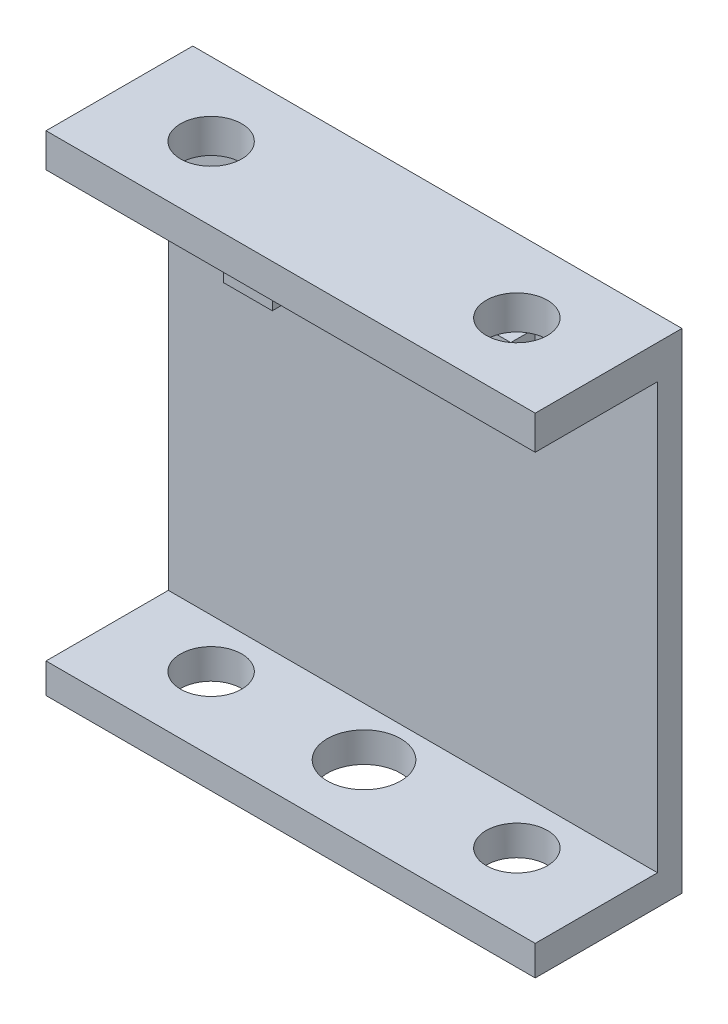
ISO-10303-21;
HEADER;
FILE_DESCRIPTION(('STEP AP214'),'2;1');
FILE_NAME('part.step','',(''),(''),'','','');
FILE_SCHEMA(('AUTOMOTIVE_DESIGN { 1 0 10303 214 1 1 1 1 }'));
ENDSEC;
DATA;
#1=APPLICATION_CONTEXT('core data for automotive mechanical design processes');
#2=APPLICATION_PROTOCOL_DEFINITION('international standard','automotive_design',2000,#1);
#3=PRODUCT_CONTEXT('',#1,'mechanical');
#4=PRODUCT('Part','Part','',(#3));
#5=PRODUCT_RELATED_PRODUCT_CATEGORY('part','',(#4));
#6=PRODUCT_DEFINITION_FORMATION('','',#4);
#7=PRODUCT_DEFINITION_CONTEXT('part definition',#1,'design');
#8=PRODUCT_DEFINITION('design','',#6,#7);
#9=PRODUCT_DEFINITION_SHAPE('','',#8);
#10=(LENGTH_UNIT() NAMED_UNIT(*) SI_UNIT(.MILLI.,.METRE.));
#11=(NAMED_UNIT(*) PLANE_ANGLE_UNIT() SI_UNIT($,.RADIAN.));
#12=(NAMED_UNIT(*) SI_UNIT($,.STERADIAN.) SOLID_ANGLE_UNIT());
#13=UNCERTAINTY_MEASURE_WITH_UNIT(LENGTH_MEASURE(1.E-05),#10,'distance_accuracy_value','');
#14=(GEOMETRIC_REPRESENTATION_CONTEXT(3) GLOBAL_UNCERTAINTY_ASSIGNED_CONTEXT((#13)) GLOBAL_UNIT_ASSIGNED_CONTEXT((#10,
#11,#12)) REPRESENTATION_CONTEXT('',''));
#15=CARTESIAN_POINT('',(0.,0.,0.));
#16=DIRECTION('',(0.,0.,1.));
#17=DIRECTION('',(1.,0.,0.));
#18=AXIS2_PLACEMENT_3D('',#15,#16,#17);
#19=CARTESIAN_POINT('',(0.,0.,2.));
#20=DIRECTION('',(0.,0.,1.));
#21=DIRECTION('',(1.,0.,0.));
#22=AXIS2_PLACEMENT_3D('',#19,#20,#21);
#23=PLANE('',#22);
#24=DIRECTION('',(0.,-1.,0.));
#25=VECTOR('',#24,1.);
#26=CARTESIAN_POINT('',(0.,-2.77187355296293,2.));
#27=LINE('',#26,#25);
#28=CARTESIAN_POINT('',(0.,-2.77187355296293,2.));
#29=VERTEX_POINT('',#28);
#30=CARTESIAN_POINT('',(0.,-37.5471930148189,2.));
#31=VERTEX_POINT('',#30);
#32=EDGE_CURVE('E239',#29,#31,#27,.T.);
#33=ORIENTED_EDGE('',*,*,#32,.T.);
#34=DIRECTION('',(1.,0.,0.));
#35=VECTOR('',#34,1.);
#36=CARTESIAN_POINT('',(0.,-37.5471930148189,2.));
#37=LINE('',#36,#35);
#38=CARTESIAN_POINT('',(40.,-37.5471930148189,2.));
#39=VERTEX_POINT('',#38);
#40=EDGE_CURVE('E243',#31,#39,#37,.T.);
#41=ORIENTED_EDGE('',*,*,#40,.T.);
#42=DIRECTION('',(0.,1.,0.));
#43=VECTOR('',#42,1.);
#44=CARTESIAN_POINT('',(40.,-2.77187355296293,2.));
#45=LINE('',#44,#43);
#46=CARTESIAN_POINT('',(40.,-2.77187355296293,2.));
#47=VERTEX_POINT('',#46);
#48=EDGE_CURVE('E248',#39,#47,#45,.T.);
#49=ORIENTED_EDGE('',*,*,#48,.T.);
#50=DIRECTION('',(-1.,0.,0.));
#51=VECTOR('',#50,1.);
#52=CARTESIAN_POINT('',(0.,-2.77187355296293,2.));
#53=LINE('',#52,#51);
#54=EDGE_CURVE('E251',#47,#29,#53,.T.);
#55=ORIENTED_EDGE('',*,*,#54,.T.);
#56=EDGE_LOOP('',(#33,#41,#49,#55));
#57=FACE_BOUND('',#56,.T.);
#58=DIRECTION('',(0.,-1.,0.));
#59=VECTOR('',#58,1.);
#60=CARTESIAN_POINT('',(26.,0.,2.));
#61=LINE('',#60,#59);
#62=CARTESIAN_POINT('',(26.,-4.,2.));
#63=VERTEX_POINT('',#62);
#64=CARTESIAN_POINT('',(26.,-8.,2.));
#65=VERTEX_POINT('',#64);
#66=EDGE_CURVE('E189',#63,#65,#61,.T.);
#67=ORIENTED_EDGE('',*,*,#66,.F.);
#68=DIRECTION('',(-1.,0.,0.));
#69=VECTOR('',#68,1.);
#70=CARTESIAN_POINT('',(0.,-4.,2.));
#71=LINE('',#70,#69);
#72=CARTESIAN_POINT('',(30.,-4.,2.));
#73=VERTEX_POINT('',#72);
#74=EDGE_CURVE('E184',#73,#63,#71,.T.);
#75=ORIENTED_EDGE('',*,*,#74,.F.);
#76=DIRECTION('',(0.,-1.,0.));
#77=VECTOR('',#76,1.);
#78=CARTESIAN_POINT('',(30.,0.,2.));
#79=LINE('',#78,#77);
#80=CARTESIAN_POINT('',(30.,-8.,2.));
#81=VERTEX_POINT('',#80);
#82=EDGE_CURVE('E200',#73,#81,#79,.T.);
#83=ORIENTED_EDGE('',*,*,#82,.T.);
#84=DIRECTION('',(-1.,0.,0.));
#85=VECTOR('',#84,1.);
#86=CARTESIAN_POINT('',(0.,-8.,2.));
#87=LINE('',#86,#85);
#88=EDGE_CURVE('E215',#81,#65,#87,.T.);
#89=ORIENTED_EDGE('',*,*,#88,.T.);
#90=EDGE_LOOP('',(#67,#75,#83,#89));
#91=FACE_BOUND('',#90,.T.);
#92=DIRECTION('',(0.,-1.,0.));
#93=VECTOR('',#92,1.);
#94=CARTESIAN_POINT('',(9.99999999999999,0.,2.));
#95=LINE('',#94,#93);
#96=CARTESIAN_POINT('',(9.99999999999999,-4.,2.));
#97=VERTEX_POINT('',#96);
#98=CARTESIAN_POINT('',(9.99999999999999,-8.,2.));
#99=VERTEX_POINT('',#98);
#100=EDGE_CURVE('E61',#97,#99,#95,.T.);
#101=ORIENTED_EDGE('',*,*,#100,.F.);
#102=DIRECTION('',(-1.,0.,0.));
#103=VECTOR('',#102,1.);
#104=CARTESIAN_POINT('',(0.,-4.,2.));
#105=LINE('',#104,#103);
#106=CARTESIAN_POINT('',(14.,-4.,2.));
#107=VERTEX_POINT('',#106);
#108=EDGE_CURVE('E182',#107,#97,#105,.T.);
#109=ORIENTED_EDGE('',*,*,#108,.F.);
#110=DIRECTION('',(0.,-1.,0.));
#111=VECTOR('',#110,1.);
#112=CARTESIAN_POINT('',(14.,0.,2.));
#113=LINE('',#112,#111);
#114=CARTESIAN_POINT('',(14.,-8.,2.));
#115=VERTEX_POINT('',#114);
#116=EDGE_CURVE('E179',#107,#115,#113,.T.);
#117=ORIENTED_EDGE('',*,*,#116,.T.);
#118=DIRECTION('',(-1.,0.,0.));
#119=VECTOR('',#118,1.);
#120=CARTESIAN_POINT('',(0.,-8.,2.));
#121=LINE('',#120,#119);
#122=EDGE_CURVE('E66',#115,#99,#121,.T.);
#123=ORIENTED_EDGE('',*,*,#122,.T.);
#124=EDGE_LOOP('',(#101,#109,#117,#123));
#125=FACE_BOUND('',#124,.T.);
#126=ADVANCED_FACE('F43',(#57,#91,#125),#23,.T.);
#127=CARTESIAN_POINT('',(0.,0.,12.));
#128=DIRECTION('',(0.,0.,1.));
#129=DIRECTION('',(1.,0.,0.));
#130=AXIS2_PLACEMENT_3D('',#127,#128,#129);
#131=PLANE('',#130);
#132=DIRECTION('',(-1.,0.,0.));
#133=VECTOR('',#132,1.);
#134=CARTESIAN_POINT('',(0.,-2.77187355296293,12.));
#135=LINE('',#134,#133);
#136=CARTESIAN_POINT('',(40.,-2.77187355296293,12.));
#137=VERTEX_POINT('',#136);
#138=CARTESIAN_POINT('',(0.,-2.77187355296293,12.));
#139=VERTEX_POINT('',#138);
#140=EDGE_CURVE('E244',#137,#139,#135,.T.);
#141=ORIENTED_EDGE('',*,*,#140,.F.);
#142=DIRECTION('',(0.,1.,0.));
#143=VECTOR('',#142,1.);
#144=CARTESIAN_POINT('',(40.,0.,12.));
#145=LINE('',#144,#143);
#146=CARTESIAN_POINT('',(40.,0.,12.));
#147=VERTEX_POINT('',#146);
#148=EDGE_CURVE('E309',#137,#147,#145,.T.);
#149=ORIENTED_EDGE('',*,*,#148,.T.);
#150=DIRECTION('',(-1.,0.,0.));
#151=VECTOR('',#150,1.);
#152=CARTESIAN_POINT('',(0.,0.,12.));
#153=LINE('',#152,#151);
#154=CARTESIAN_POINT('',(0.,0.,12.));
#155=VERTEX_POINT('',#154);
#156=EDGE_CURVE('E314',#147,#155,#153,.T.);
#157=ORIENTED_EDGE('',*,*,#156,.T.);
#158=DIRECTION('',(0.,-1.,0.));
#159=VECTOR('',#158,1.);
#160=CARTESIAN_POINT('',(0.,0.,12.));
#161=LINE('',#160,#159);
#162=EDGE_CURVE('E301',#155,#139,#161,.T.);
#163=ORIENTED_EDGE('',*,*,#162,.T.);
#164=EDGE_LOOP('',(#141,#149,#157,#163));
#165=FACE_BOUND('',#164,.T.);
#166=ADVANCED_FACE('F362',(#165),#131,.T.);
#167=CARTESIAN_POINT('',(32.5,-40.,6.));
#168=DIRECTION('',(0.,1.,0.));
#169=DIRECTION('',(0.,0.,1.));
#170=AXIS2_PLACEMENT_3D('',#167,#168,#169);
#171=CYLINDRICAL_SURFACE('',#170,2.5);
#172=CARTESIAN_POINT('',(32.5,-2.77187355296293,6.));
#173=DIRECTION('',(0.,1.,0.));
#174=DIRECTION('',(0.,0.,1.));
#175=AXIS2_PLACEMENT_3D('',#172,#173,#174);
#176=CIRCLE('',#175,2.5);
#177=CARTESIAN_POINT('',(32.5,-2.77187355296293,8.5));
#178=VERTEX_POINT('',#177);
#179=EDGE_CURVE('E280',#178,#178,#176,.F.);
#180=ORIENTED_EDGE('',*,*,#179,.T.);
#181=EDGE_LOOP('',(#180));
#182=FACE_BOUND('',#181,.T.);
#183=CARTESIAN_POINT('',(32.5,0.,6.));
#184=DIRECTION('',(0.,1.,0.));
#185=DIRECTION('',(0.,0.,1.));
#186=AXIS2_PLACEMENT_3D('',#183,#184,#185);
#187=CIRCLE('',#186,2.5);
#188=CARTESIAN_POINT('',(32.5,0.,8.5));
#189=VERTEX_POINT('',#188);
#190=EDGE_CURVE('E294',#189,#189,#187,.T.);
#191=ORIENTED_EDGE('',*,*,#190,.T.);
#192=EDGE_LOOP('',(#191));
#193=FACE_BOUND('',#192,.T.);
#194=ADVANCED_FACE('F359',(#182,#193),#171,.F.);
#195=CARTESIAN_POINT('',(7.5,-40.,6.));
#196=DIRECTION('',(0.,1.,0.));
#197=DIRECTION('',(0.,0.,1.));
#198=AXIS2_PLACEMENT_3D('',#195,#196,#197);
#199=CYLINDRICAL_SURFACE('',#198,2.5);
#200=CARTESIAN_POINT('',(7.5,-2.77187355296293,6.));
#201=DIRECTION('',(0.,1.,0.));
#202=DIRECTION('',(0.,0.,1.));
#203=AXIS2_PLACEMENT_3D('',#200,#201,#202);
#204=CIRCLE('',#203,2.5);
#205=CARTESIAN_POINT('',(7.5,-2.77187355296293,8.5));
#206=VERTEX_POINT('',#205);
#207=EDGE_CURVE('E279',#206,#206,#204,.F.);
#208=ORIENTED_EDGE('',*,*,#207,.T.);
#209=EDGE_LOOP('',(#208));
#210=FACE_BOUND('',#209,.T.);
#211=CARTESIAN_POINT('',(7.5,0.,6.));
#212=DIRECTION('',(0.,1.,0.));
#213=DIRECTION('',(0.,0.,1.));
#214=AXIS2_PLACEMENT_3D('',#211,#212,#213);
#215=CIRCLE('',#214,2.5);
#216=CARTESIAN_POINT('',(7.5,0.,8.5));
#217=VERTEX_POINT('',#216);
#218=EDGE_CURVE('E290',#217,#217,#215,.T.);
#219=ORIENTED_EDGE('',*,*,#218,.T.);
#220=EDGE_LOOP('',(#219));
#221=FACE_BOUND('',#220,.T.);
#222=ADVANCED_FACE('F346',(#210,#221),#199,.F.);
#223=CARTESIAN_POINT('',(0.,0.,12.));
#224=DIRECTION('',(1.,0.,0.));
#225=DIRECTION('',(0.,0.,-1.));
#226=AXIS2_PLACEMENT_3D('',#223,#224,#225);
#227=PLANE('',#226);
#228=ORIENTED_EDGE('',*,*,#32,.F.);
#229=DIRECTION('',(0.,0.,1.));
#230=VECTOR('',#229,1.);
#231=CARTESIAN_POINT('',(0.,-2.77187355296293,2.));
#232=LINE('',#231,#230);
#233=EDGE_CURVE('E261',#29,#139,#232,.T.);
#234=ORIENTED_EDGE('',*,*,#233,.T.);
#235=ORIENTED_EDGE('',*,*,#162,.F.);
#236=DIRECTION('',(0.,0.,-1.));
#237=VECTOR('',#236,1.);
#238=CARTESIAN_POINT('',(0.,0.,12.));
#239=LINE('',#238,#237);
#240=CARTESIAN_POINT('',(0.,0.,0.));
#241=VERTEX_POINT('',#240);
#242=EDGE_CURVE('E317',#155,#241,#239,.T.);
#243=ORIENTED_EDGE('',*,*,#242,.T.);
#244=DIRECTION('',(0.,-1.,0.));
#245=VECTOR('',#244,1.);
#246=CARTESIAN_POINT('',(0.,0.,0.));
#247=LINE('',#246,#245);
#248=CARTESIAN_POINT('',(0.,-40.,0.));
#249=VERTEX_POINT('',#248);
#250=EDGE_CURVE('E289',#241,#249,#247,.T.);
#251=ORIENTED_EDGE('',*,*,#250,.T.);
#252=DIRECTION('',(0.,0.,-1.));
#253=VECTOR('',#252,1.);
#254=CARTESIAN_POINT('',(0.,-40.,12.));
#255=LINE('',#254,#253);
#256=CARTESIAN_POINT('',(0.,-40.,12.));
#257=VERTEX_POINT('',#256);
#258=EDGE_CURVE('E11',#257,#249,#255,.T.);
#259=ORIENTED_EDGE('',*,*,#258,.F.);
#260=CARTESIAN_POINT('',(0.,-37.5471930148189,12.));
#261=VERTEX_POINT('',#260);
#262=EDGE_CURVE('E306',#261,#257,#161,.T.);
#263=ORIENTED_EDGE('',*,*,#262,.F.);
#264=DIRECTION('',(0.,0.,1.));
#265=VECTOR('',#264,1.);
#266=CARTESIAN_POINT('',(0.,-37.5471930148189,2.));
#267=LINE('',#266,#265);
#268=EDGE_CURVE('E255',#31,#261,#267,.T.);
#269=ORIENTED_EDGE('',*,*,#268,.F.);
#270=EDGE_LOOP('',(#228,#234,#235,#243,#251,#259,#263,#269));
#271=FACE_BOUND('',#270,.T.);
#272=ADVANCED_FACE('F45',(#271),#227,.F.);
#273=CARTESIAN_POINT('',(0.,-40.,12.));
#274=DIRECTION('',(0.,1.,0.));
#275=DIRECTION('',(0.,0.,1.));
#276=AXIS2_PLACEMENT_3D('',#273,#274,#275);
#277=PLANE('',#276);
#278=CARTESIAN_POINT('',(20.,-40.,6.));
#279=DIRECTION('',(0.,-1.,0.));
#280=DIRECTION('',(0.,0.,-1.));
#281=AXIS2_PLACEMENT_3D('',#278,#279,#280);
#282=CIRCLE('',#281,3.);
#283=CARTESIAN_POINT('',(20.,-40.,3.));
#284=VERTEX_POINT('',#283);
#285=EDGE_CURVE('E235',#284,#284,#282,.T.);
#286=ORIENTED_EDGE('',*,*,#285,.F.);
#287=EDGE_LOOP('',(#286));
#288=FACE_BOUND('',#287,.T.);
#289=CARTESIAN_POINT('',(7.5,-40.,6.));
#290=DIRECTION('',(0.,1.,0.));
#291=DIRECTION('',(0.,0.,1.));
#292=AXIS2_PLACEMENT_3D('',#289,#290,#291);
#293=CIRCLE('',#292,2.5);
#294=CARTESIAN_POINT('',(7.5,-40.,8.5));
#295=VERTEX_POINT('',#294);
#296=EDGE_CURVE('E285',#295,#295,#293,.T.);
#297=ORIENTED_EDGE('',*,*,#296,.T.);
#298=EDGE_LOOP('',(#297));
#299=FACE_BOUND('',#298,.T.);
#300=CARTESIAN_POINT('',(32.5,-40.,6.));
#301=DIRECTION('',(0.,1.,0.));
#302=DIRECTION('',(0.,0.,1.));
#303=AXIS2_PLACEMENT_3D('',#300,#301,#302);
#304=CIRCLE('',#303,2.5);
#305=CARTESIAN_POINT('',(32.5,-40.,8.5));
#306=VERTEX_POINT('',#305);
#307=EDGE_CURVE('E284',#306,#306,#304,.T.);
#308=ORIENTED_EDGE('',*,*,#307,.T.);
#309=EDGE_LOOP('',(#308));
#310=FACE_BOUND('',#309,.T.);
#311=DIRECTION('',(1.,0.,0.));
#312=VECTOR('',#311,1.);
#313=CARTESIAN_POINT('',(0.,-40.,0.));
#314=LINE('',#313,#312);
#315=CARTESIAN_POINT('',(40.,-40.,0.));
#316=VERTEX_POINT('',#315);
#317=EDGE_CURVE('E321',#249,#316,#314,.T.);
#318=ORIENTED_EDGE('',*,*,#317,.T.);
#319=DIRECTION('',(0.,0.,-1.));
#320=VECTOR('',#319,1.);
#321=CARTESIAN_POINT('',(40.,-40.,12.));
#322=LINE('',#321,#320);
#323=CARTESIAN_POINT('',(40.,-40.,12.));
#324=VERTEX_POINT('',#323);
#325=EDGE_CURVE('E53',#324,#316,#322,.T.);
#326=ORIENTED_EDGE('',*,*,#325,.F.);
#327=DIRECTION('',(1.,0.,0.));
#328=VECTOR('',#327,1.);
#329=CARTESIAN_POINT('',(0.,-40.,12.));
#330=LINE('',#329,#328);
#331=EDGE_CURVE('E305',#257,#324,#330,.T.);
#332=ORIENTED_EDGE('',*,*,#331,.F.);
#333=ORIENTED_EDGE('',*,*,#258,.T.);
#334=EDGE_LOOP('',(#318,#326,#332,#333));
#335=FACE_BOUND('',#334,.T.);
#336=ADVANCED_FACE('F389',(#288,#299,#310,#335),#277,.F.);
#337=CARTESIAN_POINT('',(40.,0.,12.));
#338=DIRECTION('',(-1.,0.,0.));
#339=DIRECTION('',(0.,0.,1.));
#340=AXIS2_PLACEMENT_3D('',#337,#338,#339);
#341=PLANE('',#340);
#342=ORIENTED_EDGE('',*,*,#148,.F.);
#343=DIRECTION('',(0.,0.,1.));
#344=VECTOR('',#343,1.);
#345=CARTESIAN_POINT('',(40.,-2.77187355296293,2.));
#346=LINE('',#345,#344);
#347=EDGE_CURVE('E266',#47,#137,#346,.T.);
#348=ORIENTED_EDGE('',*,*,#347,.F.);
#349=ORIENTED_EDGE('',*,*,#48,.F.);
#350=DIRECTION('',(0.,0.,1.));
#351=VECTOR('',#350,1.);
#352=CARTESIAN_POINT('',(40.,-37.5471930148189,2.));
#353=LINE('',#352,#351);
#354=CARTESIAN_POINT('',(40.,-37.5471930148189,12.));
#355=VERTEX_POINT('',#354);
#356=EDGE_CURVE('E269',#39,#355,#353,.T.);
#357=ORIENTED_EDGE('',*,*,#356,.T.);
#358=EDGE_CURVE('E310',#324,#355,#145,.T.);
#359=ORIENTED_EDGE('',*,*,#358,.F.);
#360=ORIENTED_EDGE('',*,*,#325,.T.);
#361=DIRECTION('',(0.,1.,0.));
#362=VECTOR('',#361,1.);
#363=CARTESIAN_POINT('',(40.,0.,0.));
#364=LINE('',#363,#362);
#365=CARTESIAN_POINT('',(40.,0.,0.));
#366=VERTEX_POINT('',#365);
#367=EDGE_CURVE('E324',#316,#366,#364,.T.);
#368=ORIENTED_EDGE('',*,*,#367,.T.);
#369=DIRECTION('',(0.,0.,-1.));
#370=VECTOR('',#369,1.);
#371=CARTESIAN_POINT('',(40.,0.,12.));
#372=LINE('',#371,#370);
#373=EDGE_CURVE('E333',#147,#366,#372,.T.);
#374=ORIENTED_EDGE('',*,*,#373,.F.);
#375=EDGE_LOOP('',(#342,#348,#349,#357,#359,#360,#368,#374));
#376=FACE_BOUND('',#375,.T.);
#377=ADVANCED_FACE('F371',(#376),#341,.F.);
#378=CARTESIAN_POINT('',(0.,0.,12.));
#379=DIRECTION('',(0.,-1.,0.));
#380=DIRECTION('',(0.,0.,-1.));
#381=AXIS2_PLACEMENT_3D('',#378,#379,#380);
#382=PLANE('',#381);
#383=ORIENTED_EDGE('',*,*,#218,.F.);
#384=EDGE_LOOP('',(#383));
#385=FACE_BOUND('',#384,.T.);
#386=ORIENTED_EDGE('',*,*,#190,.F.);
#387=EDGE_LOOP('',(#386));
#388=FACE_BOUND('',#387,.T.);
#389=DIRECTION('',(-1.,0.,0.));
#390=VECTOR('',#389,1.);
#391=CARTESIAN_POINT('',(0.,0.,0.));
#392=LINE('',#391,#390);
#393=EDGE_CURVE('E327',#366,#241,#392,.T.);
#394=ORIENTED_EDGE('',*,*,#393,.T.);
#395=ORIENTED_EDGE('',*,*,#242,.F.);
#396=ORIENTED_EDGE('',*,*,#156,.F.);
#397=ORIENTED_EDGE('',*,*,#373,.T.);
#398=EDGE_LOOP('',(#394,#395,#396,#397));
#399=FACE_BOUND('',#398,.T.);
#400=ADVANCED_FACE('F367',(#385,#388,#399),#382,.F.);
#401=DIRECTION('',(1.,0.,0.));
#402=VECTOR('',#401,1.);
#403=CARTESIAN_POINT('',(0.,-37.5471930148189,12.));
#404=LINE('',#403,#402);
#405=EDGE_CURVE('E256',#261,#355,#404,.T.);
#406=ORIENTED_EDGE('',*,*,#405,.F.);
#407=ORIENTED_EDGE('',*,*,#262,.T.);
#408=ORIENTED_EDGE('',*,*,#331,.T.);
#409=ORIENTED_EDGE('',*,*,#358,.T.);
#410=EDGE_LOOP('',(#406,#407,#408,#409));
#411=FACE_BOUND('',#410,.T.);
#412=ADVANCED_FACE('F370',(#411),#131,.T.);
#413=CARTESIAN_POINT('',(0.,0.,0.));
#414=DIRECTION('',(0.,0.,1.));
#415=DIRECTION('',(1.,0.,0.));
#416=AXIS2_PLACEMENT_3D('',#413,#414,#415);
#417=PLANE('',#416);
#418=ORIENTED_EDGE('',*,*,#250,.F.);
#419=ORIENTED_EDGE('',*,*,#393,.F.);
#420=ORIENTED_EDGE('',*,*,#367,.F.);
#421=ORIENTED_EDGE('',*,*,#317,.F.);
#422=EDGE_LOOP('',(#418,#419,#420,#421));
#423=FACE_BOUND('',#422,.T.);
#424=ADVANCED_FACE('F385',(#423),#417,.F.);
#425=CARTESIAN_POINT('',(32.5,-37.5471930148189,6.));
#426=DIRECTION('',(0.,-1.,0.));
#427=DIRECTION('',(0.,0.,-1.));
#428=AXIS2_PLACEMENT_3D('',#425,#426,#427);
#429=CIRCLE('',#428,2.5);
#430=CARTESIAN_POINT('',(32.5,-37.5471930148189,3.5));
#431=VERTEX_POINT('',#430);
#432=EDGE_CURVE('E275',#431,#431,#429,.F.);
#433=ORIENTED_EDGE('',*,*,#432,.T.);
#434=EDGE_LOOP('',(#433));
#435=FACE_BOUND('',#434,.T.);
#436=ORIENTED_EDGE('',*,*,#307,.F.);
#437=EDGE_LOOP('',(#436));
#438=FACE_BOUND('',#437,.T.);
#439=ADVANCED_FACE('F364',(#435,#438),#171,.F.);
#440=CARTESIAN_POINT('',(7.5,-37.5471930148189,6.));
#441=DIRECTION('',(0.,-1.,0.));
#442=DIRECTION('',(0.,0.,-1.));
#443=AXIS2_PLACEMENT_3D('',#440,#441,#442);
#444=CIRCLE('',#443,2.5);
#445=CARTESIAN_POINT('',(7.5,-37.5471930148189,3.5));
#446=VERTEX_POINT('',#445);
#447=EDGE_CURVE('E265',#446,#446,#444,.F.);
#448=ORIENTED_EDGE('',*,*,#447,.T.);
#449=EDGE_LOOP('',(#448));
#450=FACE_BOUND('',#449,.T.);
#451=ORIENTED_EDGE('',*,*,#296,.F.);
#452=EDGE_LOOP('',(#451));
#453=FACE_BOUND('',#452,.T.);
#454=ADVANCED_FACE('F353',(#450,#453),#199,.F.);
#455=CARTESIAN_POINT('',(0.,-2.77187355296293,2.));
#456=DIRECTION('',(0.,1.,0.));
#457=DIRECTION('',(0.,0.,1.));
#458=AXIS2_PLACEMENT_3D('',#455,#456,#457);
#459=PLANE('',#458);
#460=ORIENTED_EDGE('',*,*,#207,.F.);
#461=EDGE_LOOP('',(#460));
#462=FACE_BOUND('',#461,.T.);
#463=ORIENTED_EDGE('',*,*,#140,.T.);
#464=ORIENTED_EDGE('',*,*,#233,.F.);
#465=ORIENTED_EDGE('',*,*,#54,.F.);
#466=ORIENTED_EDGE('',*,*,#347,.T.);
#467=EDGE_LOOP('',(#463,#464,#465,#466));
#468=FACE_BOUND('',#467,.T.);
#469=ORIENTED_EDGE('',*,*,#179,.F.);
#470=EDGE_LOOP('',(#469));
#471=FACE_BOUND('',#470,.T.);
#472=ADVANCED_FACE('F349',(#462,#468,#471),#459,.F.);
#473=CARTESIAN_POINT('',(0.,-37.5471930148189,2.));
#474=DIRECTION('',(0.,-1.,0.));
#475=DIRECTION('',(0.,0.,-1.));
#476=AXIS2_PLACEMENT_3D('',#473,#474,#475);
#477=PLANE('',#476);
#478=CARTESIAN_POINT('',(20.,-37.5471930148189,6.));
#479=DIRECTION('',(0.,-1.,0.));
#480=DIRECTION('',(0.,0.,-1.));
#481=AXIS2_PLACEMENT_3D('',#478,#479,#480);
#482=CIRCLE('',#481,3.);
#483=CARTESIAN_POINT('',(20.,-37.5471930148189,3.));
#484=VERTEX_POINT('',#483);
#485=EDGE_CURVE('E47',#484,#484,#482,.T.);
#486=ORIENTED_EDGE('',*,*,#485,.T.);
#487=EDGE_LOOP('',(#486));
#488=FACE_BOUND('',#487,.T.);
#489=ORIENTED_EDGE('',*,*,#447,.F.);
#490=EDGE_LOOP('',(#489));
#491=FACE_BOUND('',#490,.T.);
#492=ORIENTED_EDGE('',*,*,#405,.T.);
#493=ORIENTED_EDGE('',*,*,#356,.F.);
#494=ORIENTED_EDGE('',*,*,#40,.F.);
#495=ORIENTED_EDGE('',*,*,#268,.T.);
#496=EDGE_LOOP('',(#492,#493,#494,#495));
#497=FACE_BOUND('',#496,.T.);
#498=ORIENTED_EDGE('',*,*,#432,.F.);
#499=EDGE_LOOP('',(#498));
#500=FACE_BOUND('',#499,.T.);
#501=ADVANCED_FACE('F352',(#488,#491,#497,#500),#477,.F.);
#502=CARTESIAN_POINT('',(20.,-30.,6.));
#503=DIRECTION('',(0.,-1.,0.));
#504=DIRECTION('',(0.,0.,-1.));
#505=AXIS2_PLACEMENT_3D('',#502,#503,#504);
#506=CYLINDRICAL_SURFACE('',#505,3.);
#507=ORIENTED_EDGE('',*,*,#285,.T.);
#508=EDGE_LOOP('',(#507));
#509=FACE_BOUND('',#508,.T.);
#510=ORIENTED_EDGE('',*,*,#485,.F.);
#511=EDGE_LOOP('',(#510));
#512=FACE_BOUND('',#511,.T.);
#513=ADVANCED_FACE('F442',(#509,#512),#506,.F.);
#514=CARTESIAN_POINT('',(0.,-4.,4.));
#515=DIRECTION('',(0.,-1.,0.));
#516=DIRECTION('',(0.,0.,-1.));
#517=AXIS2_PLACEMENT_3D('',#514,#515,#516);
#518=PLANE('',#517);
#519=ORIENTED_EDGE('',*,*,#74,.T.);
#520=DIRECTION('',(0.,0.,-1.));
#521=VECTOR('',#520,1.);
#522=CARTESIAN_POINT('',(26.,-4.,4.));
#523=LINE('',#522,#521);
#524=CARTESIAN_POINT('',(26.,-4.,4.));
#525=VERTEX_POINT('',#524);
#526=EDGE_CURVE('E231',#525,#63,#523,.T.);
#527=ORIENTED_EDGE('',*,*,#526,.F.);
#528=DIRECTION('',(-1.,0.,0.));
#529=VECTOR('',#528,1.);
#530=CARTESIAN_POINT('',(0.,-4.,4.));
#531=LINE('',#530,#529);
#532=CARTESIAN_POINT('',(30.,-4.,4.));
#533=VERTEX_POINT('',#532);
#534=EDGE_CURVE('E195',#533,#525,#531,.T.);
#535=ORIENTED_EDGE('',*,*,#534,.F.);
#536=DIRECTION('',(0.,0.,-1.));
#537=VECTOR('',#536,1.);
#538=CARTESIAN_POINT('',(30.,-4.,4.));
#539=LINE('',#538,#537);
#540=EDGE_CURVE('E210',#533,#73,#539,.T.);
#541=ORIENTED_EDGE('',*,*,#540,.T.);
#542=EDGE_LOOP('',(#519,#527,#535,#541));
#543=FACE_BOUND('',#542,.T.);
#544=ADVANCED_FACE('F416',(#543),#518,.F.);
#545=CARTESIAN_POINT('',(26.,0.,4.));
#546=DIRECTION('',(1.,0.,0.));
#547=DIRECTION('',(0.,0.,-1.));
#548=AXIS2_PLACEMENT_3D('',#545,#546,#547);
#549=PLANE('',#548);
#550=ORIENTED_EDGE('',*,*,#66,.T.);
#551=DIRECTION('',(0.,0.,-1.));
#552=VECTOR('',#551,1.);
#553=CARTESIAN_POINT('',(26.,-8.,4.));
#554=LINE('',#553,#552);
#555=CARTESIAN_POINT('',(26.,-8.,4.));
#556=VERTEX_POINT('',#555);
#557=EDGE_CURVE('E227',#556,#65,#554,.T.);
#558=ORIENTED_EDGE('',*,*,#557,.F.);
#559=DIRECTION('',(0.,-1.,0.));
#560=VECTOR('',#559,1.);
#561=CARTESIAN_POINT('',(26.,0.,4.));
#562=LINE('',#561,#560);
#563=EDGE_CURVE('E199',#525,#556,#562,.T.);
#564=ORIENTED_EDGE('',*,*,#563,.F.);
#565=ORIENTED_EDGE('',*,*,#526,.T.);
#566=EDGE_LOOP('',(#550,#558,#564,#565));
#567=FACE_BOUND('',#566,.T.);
#568=ADVANCED_FACE('F413',(#567),#549,.F.);
#569=CARTESIAN_POINT('',(0.,-8.,4.));
#570=DIRECTION('',(0.,-1.,0.));
#571=DIRECTION('',(0.,0.,-1.));
#572=AXIS2_PLACEMENT_3D('',#569,#570,#571);
#573=PLANE('',#572);
#574=ORIENTED_EDGE('',*,*,#88,.F.);
#575=DIRECTION('',(0.,0.,-1.));
#576=VECTOR('',#575,1.);
#577=CARTESIAN_POINT('',(30.,-8.,4.));
#578=LINE('',#577,#576);
#579=CARTESIAN_POINT('',(30.,-8.,4.));
#580=VERTEX_POINT('',#579);
#581=EDGE_CURVE('E223',#580,#81,#578,.T.);
#582=ORIENTED_EDGE('',*,*,#581,.F.);
#583=DIRECTION('',(-1.,0.,0.));
#584=VECTOR('',#583,1.);
#585=CARTESIAN_POINT('',(0.,-8.,4.));
#586=LINE('',#585,#584);
#587=EDGE_CURVE('E203',#580,#556,#586,.T.);
#588=ORIENTED_EDGE('',*,*,#587,.T.);
#589=ORIENTED_EDGE('',*,*,#557,.T.);
#590=EDGE_LOOP('',(#574,#582,#588,#589));
#591=FACE_BOUND('',#590,.T.);
#592=ADVANCED_FACE('F423',(#591),#573,.T.);
#593=CARTESIAN_POINT('',(30.,0.,4.));
#594=DIRECTION('',(1.,0.,0.));
#595=DIRECTION('',(0.,0.,-1.));
#596=AXIS2_PLACEMENT_3D('',#593,#594,#595);
#597=PLANE('',#596);
#598=ORIENTED_EDGE('',*,*,#82,.F.);
#599=ORIENTED_EDGE('',*,*,#540,.F.);
#600=DIRECTION('',(0.,-1.,0.));
#601=VECTOR('',#600,1.);
#602=CARTESIAN_POINT('',(30.,0.,4.));
#603=LINE('',#602,#601);
#604=EDGE_CURVE('E207',#533,#580,#603,.T.);
#605=ORIENTED_EDGE('',*,*,#604,.T.);
#606=ORIENTED_EDGE('',*,*,#581,.T.);
#607=EDGE_LOOP('',(#598,#599,#605,#606));
#608=FACE_BOUND('',#607,.T.);
#609=ADVANCED_FACE('F420',(#608),#597,.T.);
#610=CARTESIAN_POINT('',(0.,0.,4.));
#611=DIRECTION('',(0.,0.,1.));
#612=DIRECTION('',(1.,0.,0.));
#613=AXIS2_PLACEMENT_3D('',#610,#611,#612);
#614=PLANE('',#613);
#615=ORIENTED_EDGE('',*,*,#534,.T.);
#616=ORIENTED_EDGE('',*,*,#563,.T.);
#617=ORIENTED_EDGE('',*,*,#587,.F.);
#618=ORIENTED_EDGE('',*,*,#604,.F.);
#619=EDGE_LOOP('',(#615,#616,#617,#618));
#620=FACE_BOUND('',#619,.T.);
#621=ADVANCED_FACE('F425',(#620),#614,.T.);
#622=CARTESIAN_POINT('',(0.,-4.,7.5));
#623=DIRECTION('',(0.,-1.,0.));
#624=DIRECTION('',(0.,0.,-1.));
#625=AXIS2_PLACEMENT_3D('',#622,#623,#624);
#626=PLANE('',#625);
#627=ORIENTED_EDGE('',*,*,#108,.T.);
#628=DIRECTION('',(0.,0.,-1.));
#629=VECTOR('',#628,1.);
#630=CARTESIAN_POINT('',(9.99999999999999,-4.,7.5));
#631=LINE('',#630,#629);
#632=CARTESIAN_POINT('',(9.99999999999999,-4.,7.5));
#633=VERTEX_POINT('',#632);
#634=EDGE_CURVE('E161',#633,#97,#631,.T.);
#635=ORIENTED_EDGE('',*,*,#634,.F.);
#636=DIRECTION('',(-1.,0.,0.));
#637=VECTOR('',#636,1.);
#638=CARTESIAN_POINT('',(0.,-4.,7.5));
#639=LINE('',#638,#637);
#640=CARTESIAN_POINT('',(14.,-4.,7.5));
#641=VERTEX_POINT('',#640);
#642=EDGE_CURVE('E169',#641,#633,#639,.T.);
#643=ORIENTED_EDGE('',*,*,#642,.F.);
#644=DIRECTION('',(0.,0.,-1.));
#645=VECTOR('',#644,1.);
#646=CARTESIAN_POINT('',(14.,-4.,7.5));
#647=LINE('',#646,#645);
#648=EDGE_CURVE('E688',#641,#107,#647,.T.);
#649=ORIENTED_EDGE('',*,*,#648,.T.);
#650=EDGE_LOOP('',(#627,#635,#643,#649));
#651=FACE_BOUND('',#650,.T.);
#652=ADVANCED_FACE('F181',(#651),#626,.F.);
#653=CARTESIAN_POINT('',(9.99999999999999,0.,7.5));
#654=DIRECTION('',(1.,0.,0.));
#655=DIRECTION('',(0.,0.,-1.));
#656=AXIS2_PLACEMENT_3D('',#653,#654,#655);
#657=PLANE('',#656);
#658=ORIENTED_EDGE('',*,*,#100,.T.);
#659=DIRECTION('',(0.,0.,-1.));
#660=VECTOR('',#659,1.);
#661=CARTESIAN_POINT('',(9.99999999999999,-8.,7.5));
#662=LINE('',#661,#660);
#663=CARTESIAN_POINT('',(9.99999999999999,-8.,7.5));
#664=VERTEX_POINT('',#663);
#665=EDGE_CURVE('E163',#664,#99,#662,.T.);
#666=ORIENTED_EDGE('',*,*,#665,.F.);
#667=DIRECTION('',(0.,-1.,0.));
#668=VECTOR('',#667,1.);
#669=CARTESIAN_POINT('',(9.99999999999999,0.,7.5));
#670=LINE('',#669,#668);
#671=EDGE_CURVE('E157',#633,#664,#670,.T.);
#672=ORIENTED_EDGE('',*,*,#671,.F.);
#673=ORIENTED_EDGE('',*,*,#634,.T.);
#674=EDGE_LOOP('',(#658,#666,#672,#673));
#675=FACE_BOUND('',#674,.T.);
#676=ADVANCED_FACE('F159',(#675),#657,.F.);
#677=CARTESIAN_POINT('',(0.,-8.,7.5));
#678=DIRECTION('',(0.,-1.,0.));
#679=DIRECTION('',(0.,0.,-1.));
#680=AXIS2_PLACEMENT_3D('',#677,#678,#679);
#681=PLANE('',#680);
#682=ORIENTED_EDGE('',*,*,#122,.F.);
#683=DIRECTION('',(0.,0.,-1.));
#684=VECTOR('',#683,1.);
#685=CARTESIAN_POINT('',(14.,-8.,7.5));
#686=LINE('',#685,#684);
#687=CARTESIAN_POINT('',(14.,-8.,7.5));
#688=VERTEX_POINT('',#687);
#689=EDGE_CURVE('E191',#688,#115,#686,.T.);
#690=ORIENTED_EDGE('',*,*,#689,.F.);
#691=DIRECTION('',(-1.,0.,0.));
#692=VECTOR('',#691,1.);
#693=CARTESIAN_POINT('',(0.,-8.,7.5));
#694=LINE('',#693,#692);
#695=EDGE_CURVE('E168',#688,#664,#694,.T.);
#696=ORIENTED_EDGE('',*,*,#695,.T.);
#697=ORIENTED_EDGE('',*,*,#665,.T.);
#698=EDGE_LOOP('',(#682,#690,#696,#697));
#699=FACE_BOUND('',#698,.T.);
#700=ADVANCED_FACE('F516',(#699),#681,.T.);
#701=CARTESIAN_POINT('',(14.,0.,7.5));
#702=DIRECTION('',(1.,0.,0.));
#703=DIRECTION('',(0.,1.,0.));
#704=AXIS2_PLACEMENT_3D('',#701,#702,#703);
#705=PLANE('',#704);
#706=ORIENTED_EDGE('',*,*,#116,.F.);
#707=ORIENTED_EDGE('',*,*,#648,.F.);
#708=DIRECTION('',(0.,-1.,0.));
#709=VECTOR('',#708,1.);
#710=CARTESIAN_POINT('',(14.,0.,7.5));
#711=LINE('',#710,#709);
#712=EDGE_CURVE('E175',#641,#688,#711,.T.);
#713=ORIENTED_EDGE('',*,*,#712,.T.);
#714=ORIENTED_EDGE('',*,*,#689,.T.);
#715=EDGE_LOOP('',(#706,#707,#713,#714));
#716=FACE_BOUND('',#715,.T.);
#717=ADVANCED_FACE('F525',(#716),#705,.T.);
#718=CARTESIAN_POINT('',(0.,0.,7.5));
#719=DIRECTION('',(0.,0.,1.));
#720=DIRECTION('',(1.,0.,0.));
#721=AXIS2_PLACEMENT_3D('',#718,#719,#720);
#722=PLANE('',#721);
#723=ORIENTED_EDGE('',*,*,#642,.T.);
#724=ORIENTED_EDGE('',*,*,#671,.T.);
#725=ORIENTED_EDGE('',*,*,#695,.F.);
#726=ORIENTED_EDGE('',*,*,#712,.F.);
#727=EDGE_LOOP('',(#723,#724,#725,#726));
#728=FACE_BOUND('',#727,.T.);
#729=ADVANCED_FACE('F173',(#728),#722,.T.);
#730=CLOSED_SHELL('',(#126,#166,#194,#222,#272,#336,#377,#400,#412,#424,#439,#454,#472,#501,
#513,#544,#568,#592,#609,#621,#652,#676,#700,#717,#729));
#731=MANIFOLD_SOLID_BREP('B2',#730);
#732=ADVANCED_BREP_SHAPE_REPRESENTATION('',(#18,#731),#14);
#733=SHAPE_DEFINITION_REPRESENTATION(#9,#732);
ENDSEC;
END-ISO-10303-21;
